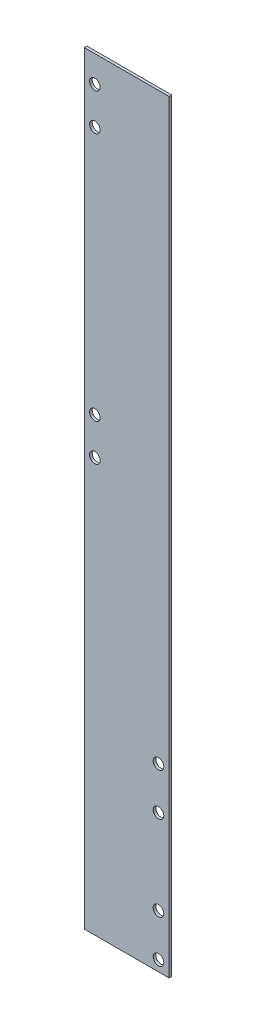
ISO-10303-21;
HEADER;
FILE_DESCRIPTION(('STEP AP214'),'2;1');
FILE_NAME('part.step','',(''),(''),'','','');
FILE_SCHEMA(('AUTOMOTIVE_DESIGN { 1 0 10303 214 1 1 1 1 }'));
ENDSEC;
DATA;
#1=APPLICATION_CONTEXT('core data for automotive mechanical design processes');
#2=APPLICATION_PROTOCOL_DEFINITION('international standard','automotive_design',2000,#1);
#3=PRODUCT_CONTEXT('',#1,'mechanical');
#4=PRODUCT('Part','Part','',(#3));
#5=PRODUCT_RELATED_PRODUCT_CATEGORY('part','',(#4));
#6=PRODUCT_DEFINITION_FORMATION('','',#4);
#7=PRODUCT_DEFINITION_CONTEXT('part definition',#1,'design');
#8=PRODUCT_DEFINITION('design','',#6,#7);
#9=PRODUCT_DEFINITION_SHAPE('','',#8);
#10=(LENGTH_UNIT() NAMED_UNIT(*) SI_UNIT(.MILLI.,.METRE.));
#11=(NAMED_UNIT(*) PLANE_ANGLE_UNIT() SI_UNIT($,.RADIAN.));
#12=(NAMED_UNIT(*) SI_UNIT($,.STERADIAN.) SOLID_ANGLE_UNIT());
#13=UNCERTAINTY_MEASURE_WITH_UNIT(LENGTH_MEASURE(1.E-05),#10,'distance_accuracy_value','');
#14=(GEOMETRIC_REPRESENTATION_CONTEXT(3) GLOBAL_UNCERTAINTY_ASSIGNED_CONTEXT((#13)) GLOBAL_UNIT_ASSIGNED_CONTEXT((#10,
#11,#12)) REPRESENTATION_CONTEXT('',''));
#15=CARTESIAN_POINT('',(0.,0.,0.));
#16=DIRECTION('',(0.,0.,1.));
#17=DIRECTION('',(1.,0.,0.));
#18=AXIS2_PLACEMENT_3D('',#15,#16,#17);
#19=CARTESIAN_POINT('',(101.6,0.,-3.175));
#20=DIRECTION('',(0.,-1.,0.));
#21=DIRECTION('',(0.,0.,-1.));
#22=AXIS2_PLACEMENT_3D('',#19,#20,#21);
#23=PLANE('',#22);
#24=DIRECTION('',(0.,0.,1.));
#25=VECTOR('',#24,1.);
#26=CARTESIAN_POINT('',(0.,0.,-3.175));
#27=LINE('',#26,#25);
#28=CARTESIAN_POINT('',(0.,0.,-3.175));
#29=VERTEX_POINT('',#28);
#30=CARTESIAN_POINT('',(0.,0.,0.));
#31=VERTEX_POINT('',#30);
#32=EDGE_CURVE('E78',#29,#31,#27,.T.);
#33=ORIENTED_EDGE('',*,*,#32,.T.);
#34=DIRECTION('',(-1.,0.,0.));
#35=VECTOR('',#34,1.);
#36=CARTESIAN_POINT('',(101.6,0.,0.));
#37=LINE('',#36,#35);
#38=CARTESIAN_POINT('',(101.6,0.,0.));
#39=VERTEX_POINT('',#38);
#40=EDGE_CURVE('E11',#39,#31,#37,.T.);
#41=ORIENTED_EDGE('',*,*,#40,.F.);
#42=DIRECTION('',(0.,0.,1.));
#43=VECTOR('',#42,1.);
#44=CARTESIAN_POINT('',(101.6,0.,-3.175));
#45=LINE('',#44,#43);
#46=CARTESIAN_POINT('',(101.6,0.,-3.175));
#47=VERTEX_POINT('',#46);
#48=EDGE_CURVE('E102',#47,#39,#45,.T.);
#49=ORIENTED_EDGE('',*,*,#48,.F.);
#50=DIRECTION('',(-1.,0.,0.));
#51=VECTOR('',#50,1.);
#52=CARTESIAN_POINT('',(101.6,0.,-3.175));
#53=LINE('',#52,#51);
#54=EDGE_CURVE('E90',#47,#29,#53,.T.);
#55=ORIENTED_EDGE('',*,*,#54,.T.);
#56=EDGE_LOOP('',(#33,#41,#49,#55));
#57=FACE_BOUND('',#56,.T.);
#58=ADVANCED_FACE('F32',(#57),#23,.F.);
#59=CARTESIAN_POINT('',(101.6,0.,0.));
#60=DIRECTION('',(0.,0.,-1.));
#61=DIRECTION('',(0.,1.,0.));
#62=AXIS2_PLACEMENT_3D('',#59,#60,#61);
#63=PLANE('',#62);
#64=CARTESIAN_POINT('',(12.7,-31.75,0.));
#65=DIRECTION('',(0.,0.,1.));
#66=DIRECTION('',(1.,0.,0.));
#67=AXIS2_PLACEMENT_3D('',#64,#65,#66);
#68=CIRCLE('',#67,6.35);
#69=CARTESIAN_POINT('',(19.05,-31.75,0.));
#70=VERTEX_POINT('',#69);
#71=EDGE_CURVE('E143',#70,#70,#68,.T.);
#72=ORIENTED_EDGE('',*,*,#71,.F.);
#73=EDGE_LOOP('',(#72));
#74=FACE_BOUND('',#73,.T.);
#75=CARTESIAN_POINT('',(12.7,-76.2,0.));
#76=DIRECTION('',(0.,0.,1.));
#77=DIRECTION('',(1.,0.,0.));
#78=AXIS2_PLACEMENT_3D('',#75,#76,#77);
#79=CIRCLE('',#78,6.35);
#80=CARTESIAN_POINT('',(19.05,-76.2,0.));
#81=VERTEX_POINT('',#80);
#82=EDGE_CURVE('E133',#81,#81,#79,.T.);
#83=ORIENTED_EDGE('',*,*,#82,.F.);
#84=EDGE_LOOP('',(#83));
#85=FACE_BOUND('',#84,.T.);
#86=CARTESIAN_POINT('',(12.7,-374.65,0.));
#87=DIRECTION('',(0.,0.,1.));
#88=DIRECTION('',(1.,0.,0.));
#89=AXIS2_PLACEMENT_3D('',#86,#87,#88);
#90=CIRCLE('',#89,6.35);
#91=CARTESIAN_POINT('',(19.05,-374.65,0.));
#92=VERTEX_POINT('',#91);
#93=EDGE_CURVE('E130',#92,#92,#90,.T.);
#94=ORIENTED_EDGE('',*,*,#93,.F.);
#95=EDGE_LOOP('',(#94));
#96=FACE_BOUND('',#95,.T.);
#97=CARTESIAN_POINT('',(12.7,-419.1,0.));
#98=DIRECTION('',(0.,0.,1.));
#99=DIRECTION('',(1.,0.,0.));
#100=AXIS2_PLACEMENT_3D('',#97,#98,#99);
#101=CIRCLE('',#100,6.35);
#102=CARTESIAN_POINT('',(19.05,-419.1,0.));
#103=VERTEX_POINT('',#102);
#104=EDGE_CURVE('E127',#103,#103,#101,.T.);
#105=ORIENTED_EDGE('',*,*,#104,.F.);
#106=EDGE_LOOP('',(#105));
#107=FACE_BOUND('',#106,.T.);
#108=CARTESIAN_POINT('',(88.9,-698.5,0.));
#109=DIRECTION('',(0.,0.,1.));
#110=DIRECTION('',(1.,0.,0.));
#111=AXIS2_PLACEMENT_3D('',#108,#109,#110);
#112=CIRCLE('',#111,6.34999999999999);
#113=CARTESIAN_POINT('',(95.25,-698.5,0.));
#114=VERTEX_POINT('',#113);
#115=EDGE_CURVE('E123',#114,#114,#112,.T.);
#116=ORIENTED_EDGE('',*,*,#115,.F.);
#117=EDGE_LOOP('',(#116));
#118=FACE_BOUND('',#117,.T.);
#119=CARTESIAN_POINT('',(88.9,-749.3,0.));
#120=DIRECTION('',(0.,0.,1.));
#121=DIRECTION('',(1.,0.,0.));
#122=AXIS2_PLACEMENT_3D('',#119,#120,#121);
#123=CIRCLE('',#122,6.34999999999999);
#124=CARTESIAN_POINT('',(95.25,-749.3,0.));
#125=VERTEX_POINT('',#124);
#126=EDGE_CURVE('E119',#125,#125,#123,.T.);
#127=ORIENTED_EDGE('',*,*,#126,.F.);
#128=EDGE_LOOP('',(#127));
#129=FACE_BOUND('',#128,.T.);
#130=CARTESIAN_POINT('',(88.9,-850.9,0.));
#131=DIRECTION('',(0.,0.,1.));
#132=DIRECTION('',(1.,0.,0.));
#133=AXIS2_PLACEMENT_3D('',#130,#131,#132);
#134=CIRCLE('',#133,6.34999999999999);
#135=CARTESIAN_POINT('',(95.25,-850.9,0.));
#136=VERTEX_POINT('',#135);
#137=EDGE_CURVE('E115',#136,#136,#134,.T.);
#138=ORIENTED_EDGE('',*,*,#137,.F.);
#139=EDGE_LOOP('',(#138));
#140=FACE_BOUND('',#139,.T.);
#141=CARTESIAN_POINT('',(88.9,-901.7,0.));
#142=DIRECTION('',(0.,0.,1.));
#143=DIRECTION('',(1.,0.,0.));
#144=AXIS2_PLACEMENT_3D('',#141,#142,#143);
#145=CIRCLE('',#144,6.34999999999999);
#146=CARTESIAN_POINT('',(95.25,-901.7,0.));
#147=VERTEX_POINT('',#146);
#148=EDGE_CURVE('E94',#147,#147,#145,.T.);
#149=ORIENTED_EDGE('',*,*,#148,.F.);
#150=EDGE_LOOP('',(#149));
#151=FACE_BOUND('',#150,.T.);
#152=DIRECTION('',(0.,-1.,0.));
#153=VECTOR('',#152,1.);
#154=CARTESIAN_POINT('',(0.,0.,0.));
#155=LINE('',#154,#153);
#156=CARTESIAN_POINT('',(0.,-914.4,-1.11978004993518E-13));
#157=VERTEX_POINT('',#156);
#158=EDGE_CURVE('E74',#31,#157,#155,.T.);
#159=ORIENTED_EDGE('',*,*,#158,.T.);
#160=DIRECTION('',(-1.,0.,0.));
#161=VECTOR('',#160,1.);
#162=CARTESIAN_POINT('',(101.6,-914.4,-1.11978004993518E-13));
#163=LINE('',#162,#161);
#164=CARTESIAN_POINT('',(101.6,-914.4,-1.11978004993518E-13));
#165=VERTEX_POINT('',#164);
#166=EDGE_CURVE('E40',#165,#157,#163,.T.);
#167=ORIENTED_EDGE('',*,*,#166,.F.);
#168=DIRECTION('',(0.,-1.,0.));
#169=VECTOR('',#168,1.);
#170=CARTESIAN_POINT('',(101.6,0.,0.));
#171=LINE('',#170,#169);
#172=EDGE_CURVE('E86',#39,#165,#171,.T.);
#173=ORIENTED_EDGE('',*,*,#172,.F.);
#174=ORIENTED_EDGE('',*,*,#40,.T.);
#175=EDGE_LOOP('',(#159,#167,#173,#174));
#176=FACE_BOUND('',#175,.T.);
#177=ADVANCED_FACE('F85',(#74,#85,#96,#107,#118,#129,#140,#151,#176),#63,.F.);
#178=CARTESIAN_POINT('',(101.6,-914.4,-1.11978004993518E-13));
#179=DIRECTION('',(0.,1.,0.));
#180=DIRECTION('',(0.,0.,1.));
#181=AXIS2_PLACEMENT_3D('',#178,#179,#180);
#182=PLANE('',#181);
#183=DIRECTION('',(0.,0.,-1.));
#184=VECTOR('',#183,1.);
#185=CARTESIAN_POINT('',(0.,-914.4,-1.11978004993518E-13));
#186=LINE('',#185,#184);
#187=CARTESIAN_POINT('',(0.,-914.4,-3.17500000000012));
#188=VERTEX_POINT('',#187);
#189=EDGE_CURVE('E79',#157,#188,#186,.T.);
#190=ORIENTED_EDGE('',*,*,#189,.T.);
#191=DIRECTION('',(-1.,0.,0.));
#192=VECTOR('',#191,1.);
#193=CARTESIAN_POINT('',(101.6,-914.4,-3.17500000000012));
#194=LINE('',#193,#192);
#195=CARTESIAN_POINT('',(101.6,-914.4,-3.17500000000012));
#196=VERTEX_POINT('',#195);
#197=EDGE_CURVE('E108',#196,#188,#194,.T.);
#198=ORIENTED_EDGE('',*,*,#197,.F.);
#199=DIRECTION('',(0.,0.,-1.));
#200=VECTOR('',#199,1.);
#201=CARTESIAN_POINT('',(101.6,-914.4,-1.11978004993518E-13));
#202=LINE('',#201,#200);
#203=EDGE_CURVE('E53',#165,#196,#202,.T.);
#204=ORIENTED_EDGE('',*,*,#203,.F.);
#205=ORIENTED_EDGE('',*,*,#166,.T.);
#206=EDGE_LOOP('',(#190,#198,#204,#205));
#207=FACE_BOUND('',#206,.T.);
#208=ADVANCED_FACE('F159',(#207),#182,.F.);
#209=CARTESIAN_POINT('',(101.6,-914.4,-3.17500000000012));
#210=DIRECTION('',(0.,0.,1.));
#211=DIRECTION('',(0.,-1.,0.));
#212=AXIS2_PLACEMENT_3D('',#209,#210,#211);
#213=PLANE('',#212);
#214=CARTESIAN_POINT('',(12.7,-31.75,-3.175));
#215=DIRECTION('',(0.,0.,1.));
#216=DIRECTION('',(0.,-1.,0.));
#217=AXIS2_PLACEMENT_3D('',#214,#215,#216);
#218=CIRCLE('',#217,6.35);
#219=CARTESIAN_POINT('',(12.7,-38.1000000000001,-3.17500000000001));
#220=VERTEX_POINT('',#219);
#221=EDGE_CURVE('E35',#220,#220,#218,.T.);
#222=ORIENTED_EDGE('',*,*,#221,.T.);
#223=EDGE_LOOP('',(#222));
#224=FACE_BOUND('',#223,.T.);
#225=CARTESIAN_POINT('',(12.7,-76.2,-3.17500000000001));
#226=DIRECTION('',(0.,0.,1.));
#227=DIRECTION('',(0.,-1.,0.));
#228=AXIS2_PLACEMENT_3D('',#225,#226,#227);
#229=CIRCLE('',#228,6.35);
#230=CARTESIAN_POINT('',(12.7,-82.55,-3.17500000000001));
#231=VERTEX_POINT('',#230);
#232=EDGE_CURVE('E131',#231,#231,#229,.T.);
#233=ORIENTED_EDGE('',*,*,#232,.T.);
#234=EDGE_LOOP('',(#233));
#235=FACE_BOUND('',#234,.T.);
#236=CARTESIAN_POINT('',(12.7,-374.65,-3.17500000000005));
#237=DIRECTION('',(0.,0.,1.));
#238=DIRECTION('',(0.,-1.,0.));
#239=AXIS2_PLACEMENT_3D('',#236,#237,#238);
#240=CIRCLE('',#239,6.35);
#241=CARTESIAN_POINT('',(12.7,-381.,-3.17500000000005));
#242=VERTEX_POINT('',#241);
#243=EDGE_CURVE('E128',#242,#242,#240,.T.);
#244=ORIENTED_EDGE('',*,*,#243,.T.);
#245=EDGE_LOOP('',(#244));
#246=FACE_BOUND('',#245,.T.);
#247=CARTESIAN_POINT('',(12.7,-419.1,-3.17500000000006));
#248=DIRECTION('',(0.,0.,1.));
#249=DIRECTION('',(0.,-1.,0.));
#250=AXIS2_PLACEMENT_3D('',#247,#248,#249);
#251=CIRCLE('',#250,6.35);
#252=CARTESIAN_POINT('',(12.7,-425.45,-3.17500000000006));
#253=VERTEX_POINT('',#252);
#254=EDGE_CURVE('E124',#253,#253,#251,.T.);
#255=ORIENTED_EDGE('',*,*,#254,.T.);
#256=EDGE_LOOP('',(#255));
#257=FACE_BOUND('',#256,.T.);
#258=CARTESIAN_POINT('',(88.9,-698.5,-3.17500000000009));
#259=DIRECTION('',(0.,0.,1.));
#260=DIRECTION('',(0.,-1.,0.));
#261=AXIS2_PLACEMENT_3D('',#258,#259,#260);
#262=CIRCLE('',#261,6.34999999999999);
#263=CARTESIAN_POINT('',(88.9,-704.85,-3.1750000000001));
#264=VERTEX_POINT('',#263);
#265=EDGE_CURVE('E120',#264,#264,#262,.T.);
#266=ORIENTED_EDGE('',*,*,#265,.T.);
#267=EDGE_LOOP('',(#266));
#268=FACE_BOUND('',#267,.T.);
#269=CARTESIAN_POINT('',(88.9,-749.3,-3.1750000000001));
#270=DIRECTION('',(0.,0.,1.));
#271=DIRECTION('',(0.,-1.,0.));
#272=AXIS2_PLACEMENT_3D('',#269,#270,#271);
#273=CIRCLE('',#272,6.34999999999999);
#274=CARTESIAN_POINT('',(88.9,-755.65,-3.1750000000001));
#275=VERTEX_POINT('',#274);
#276=EDGE_CURVE('E116',#275,#275,#273,.T.);
#277=ORIENTED_EDGE('',*,*,#276,.T.);
#278=EDGE_LOOP('',(#277));
#279=FACE_BOUND('',#278,.T.);
#280=CARTESIAN_POINT('',(88.9,-850.9,-3.17500000000012));
#281=DIRECTION('',(0.,0.,1.));
#282=DIRECTION('',(0.,-1.,0.));
#283=AXIS2_PLACEMENT_3D('',#280,#281,#282);
#284=CIRCLE('',#283,6.34999999999999);
#285=CARTESIAN_POINT('',(88.9,-857.25,-3.17500000000012));
#286=VERTEX_POINT('',#285);
#287=EDGE_CURVE('E112',#286,#286,#284,.T.);
#288=ORIENTED_EDGE('',*,*,#287,.T.);
#289=EDGE_LOOP('',(#288));
#290=FACE_BOUND('',#289,.T.);
#291=CARTESIAN_POINT('',(88.9,-901.7,-3.17500000000012));
#292=DIRECTION('',(0.,0.,1.));
#293=DIRECTION('',(0.,-1.,0.));
#294=AXIS2_PLACEMENT_3D('',#291,#292,#293);
#295=CIRCLE('',#294,6.34999999999999);
#296=CARTESIAN_POINT('',(88.9,-908.05,-3.17500000000012));
#297=VERTEX_POINT('',#296);
#298=EDGE_CURVE('E91',#297,#297,#295,.T.);
#299=ORIENTED_EDGE('',*,*,#298,.T.);
#300=EDGE_LOOP('',(#299));
#301=FACE_BOUND('',#300,.T.);
#302=DIRECTION('',(0.,1.,0.));
#303=VECTOR('',#302,1.);
#304=CARTESIAN_POINT('',(0.,-914.4,-3.17500000000012));
#305=LINE('',#304,#303);
#306=EDGE_CURVE('E100',#188,#29,#305,.T.);
#307=ORIENTED_EDGE('',*,*,#306,.T.);
#308=ORIENTED_EDGE('',*,*,#54,.F.);
#309=DIRECTION('',(0.,1.,0.));
#310=VECTOR('',#309,1.);
#311=CARTESIAN_POINT('',(101.6,-914.4,-3.17500000000012));
#312=LINE('',#311,#310);
#313=EDGE_CURVE('E48',#196,#47,#312,.T.);
#314=ORIENTED_EDGE('',*,*,#313,.F.);
#315=ORIENTED_EDGE('',*,*,#197,.T.);
#316=EDGE_LOOP('',(#307,#308,#314,#315));
#317=FACE_BOUND('',#316,.T.);
#318=ADVANCED_FACE('F170',(#224,#235,#246,#257,#268,#279,#290,#301,#317),#213,.F.);
#319=CARTESIAN_POINT('',(101.6,0.,0.));
#320=DIRECTION('',(1.,0.,0.));
#321=DIRECTION('',(0.,0.,-1.));
#322=AXIS2_PLACEMENT_3D('',#319,#320,#321);
#323=PLANE('',#322);
#324=ORIENTED_EDGE('',*,*,#48,.T.);
#325=ORIENTED_EDGE('',*,*,#172,.T.);
#326=ORIENTED_EDGE('',*,*,#203,.T.);
#327=ORIENTED_EDGE('',*,*,#313,.T.);
#328=EDGE_LOOP('',(#324,#325,#326,#327));
#329=FACE_BOUND('',#328,.T.);
#330=ADVANCED_FACE('F173',(#329),#323,.T.);
#331=CARTESIAN_POINT('',(0.,0.,0.));
#332=DIRECTION('',(1.,0.,0.));
#333=DIRECTION('',(0.,0.,-1.));
#334=AXIS2_PLACEMENT_3D('',#331,#332,#333);
#335=PLANE('',#334);
#336=ORIENTED_EDGE('',*,*,#32,.F.);
#337=ORIENTED_EDGE('',*,*,#306,.F.);
#338=ORIENTED_EDGE('',*,*,#189,.F.);
#339=ORIENTED_EDGE('',*,*,#158,.F.);
#340=EDGE_LOOP('',(#336,#337,#338,#339));
#341=FACE_BOUND('',#340,.T.);
#342=ADVANCED_FACE('F75',(#341),#335,.F.);
#343=CARTESIAN_POINT('',(88.9,-901.7,-50.8));
#344=DIRECTION('',(0.,0.,1.));
#345=DIRECTION('',(1.,0.,0.));
#346=AXIS2_PLACEMENT_3D('',#343,#344,#345);
#347=CYLINDRICAL_SURFACE('',#346,6.34999999999999);
#348=ORIENTED_EDGE('',*,*,#148,.T.);
#349=EDGE_LOOP('',(#348));
#350=FACE_BOUND('',#349,.T.);
#351=ORIENTED_EDGE('',*,*,#298,.F.);
#352=EDGE_LOOP('',(#351));
#353=FACE_BOUND('',#352,.T.);
#354=ADVANCED_FACE('F164',(#350,#353),#347,.F.);
#355=CARTESIAN_POINT('',(88.9,-850.9,-50.8));
#356=DIRECTION('',(0.,0.,1.));
#357=DIRECTION('',(1.,0.,0.));
#358=AXIS2_PLACEMENT_3D('',#355,#356,#357);
#359=CYLINDRICAL_SURFACE('',#358,6.34999999999999);
#360=ORIENTED_EDGE('',*,*,#137,.T.);
#361=EDGE_LOOP('',(#360));
#362=FACE_BOUND('',#361,.T.);
#363=ORIENTED_EDGE('',*,*,#287,.F.);
#364=EDGE_LOOP('',(#363));
#365=FACE_BOUND('',#364,.T.);
#366=ADVANCED_FACE('F154',(#362,#365),#359,.F.);
#367=CARTESIAN_POINT('',(88.9,-749.3,-50.8));
#368=DIRECTION('',(0.,0.,1.));
#369=DIRECTION('',(1.,0.,0.));
#370=AXIS2_PLACEMENT_3D('',#367,#368,#369);
#371=CYLINDRICAL_SURFACE('',#370,6.34999999999999);
#372=ORIENTED_EDGE('',*,*,#126,.T.);
#373=EDGE_LOOP('',(#372));
#374=FACE_BOUND('',#373,.T.);
#375=ORIENTED_EDGE('',*,*,#276,.F.);
#376=EDGE_LOOP('',(#375));
#377=FACE_BOUND('',#376,.T.);
#378=ADVANCED_FACE('F250',(#374,#377),#371,.F.);
#379=CARTESIAN_POINT('',(88.9,-698.5,-50.8));
#380=DIRECTION('',(0.,0.,1.));
#381=DIRECTION('',(1.,0.,0.));
#382=AXIS2_PLACEMENT_3D('',#379,#380,#381);
#383=CYLINDRICAL_SURFACE('',#382,6.34999999999999);
#384=ORIENTED_EDGE('',*,*,#115,.T.);
#385=EDGE_LOOP('',(#384));
#386=FACE_BOUND('',#385,.T.);
#387=ORIENTED_EDGE('',*,*,#265,.F.);
#388=EDGE_LOOP('',(#387));
#389=FACE_BOUND('',#388,.T.);
#390=ADVANCED_FACE('F195',(#386,#389),#383,.F.);
#391=CARTESIAN_POINT('',(12.7,-419.1,-50.8));
#392=DIRECTION('',(0.,0.,1.));
#393=DIRECTION('',(1.,0.,0.));
#394=AXIS2_PLACEMENT_3D('',#391,#392,#393);
#395=CYLINDRICAL_SURFACE('',#394,6.35);
#396=ORIENTED_EDGE('',*,*,#104,.T.);
#397=EDGE_LOOP('',(#396));
#398=FACE_BOUND('',#397,.T.);
#399=ORIENTED_EDGE('',*,*,#254,.F.);
#400=EDGE_LOOP('',(#399));
#401=FACE_BOUND('',#400,.T.);
#402=ADVANCED_FACE('F208',(#398,#401),#395,.F.);
#403=CARTESIAN_POINT('',(12.7,-374.65,-50.8));
#404=DIRECTION('',(0.,0.,1.));
#405=DIRECTION('',(1.,0.,0.));
#406=AXIS2_PLACEMENT_3D('',#403,#404,#405);
#407=CYLINDRICAL_SURFACE('',#406,6.35);
#408=ORIENTED_EDGE('',*,*,#93,.T.);
#409=EDGE_LOOP('',(#408));
#410=FACE_BOUND('',#409,.T.);
#411=ORIENTED_EDGE('',*,*,#243,.F.);
#412=EDGE_LOOP('',(#411));
#413=FACE_BOUND('',#412,.T.);
#414=ADVANCED_FACE('F213',(#410,#413),#407,.F.);
#415=CARTESIAN_POINT('',(12.7,-76.2,-50.8));
#416=DIRECTION('',(0.,0.,1.));
#417=DIRECTION('',(1.,0.,0.));
#418=AXIS2_PLACEMENT_3D('',#415,#416,#417);
#419=CYLINDRICAL_SURFACE('',#418,6.35);
#420=ORIENTED_EDGE('',*,*,#82,.T.);
#421=EDGE_LOOP('',(#420));
#422=FACE_BOUND('',#421,.T.);
#423=ORIENTED_EDGE('',*,*,#232,.F.);
#424=EDGE_LOOP('',(#423));
#425=FACE_BOUND('',#424,.T.);
#426=ADVANCED_FACE('F223',(#422,#425),#419,.F.);
#427=CARTESIAN_POINT('',(12.7,-31.75,-50.8));
#428=DIRECTION('',(0.,0.,1.));
#429=DIRECTION('',(1.,0.,0.));
#430=AXIS2_PLACEMENT_3D('',#427,#428,#429);
#431=CYLINDRICAL_SURFACE('',#430,6.35);
#432=ORIENTED_EDGE('',*,*,#71,.T.);
#433=EDGE_LOOP('',(#432));
#434=FACE_BOUND('',#433,.T.);
#435=ORIENTED_EDGE('',*,*,#221,.F.);
#436=EDGE_LOOP('',(#435));
#437=FACE_BOUND('',#436,.T.);
#438=ADVANCED_FACE('F233',(#434,#437),#431,.F.);
#439=CLOSED_SHELL('',(#58,#177,#208,#318,#330,#342,#354,#366,#378,#390,#402,#414,#426,#438));
#440=MANIFOLD_SOLID_BREP('B2',#439);
#441=ADVANCED_BREP_SHAPE_REPRESENTATION('',(#18,#440),#14);
#442=SHAPE_DEFINITION_REPRESENTATION(#9,#441);
ENDSEC;
END-ISO-10303-21;
